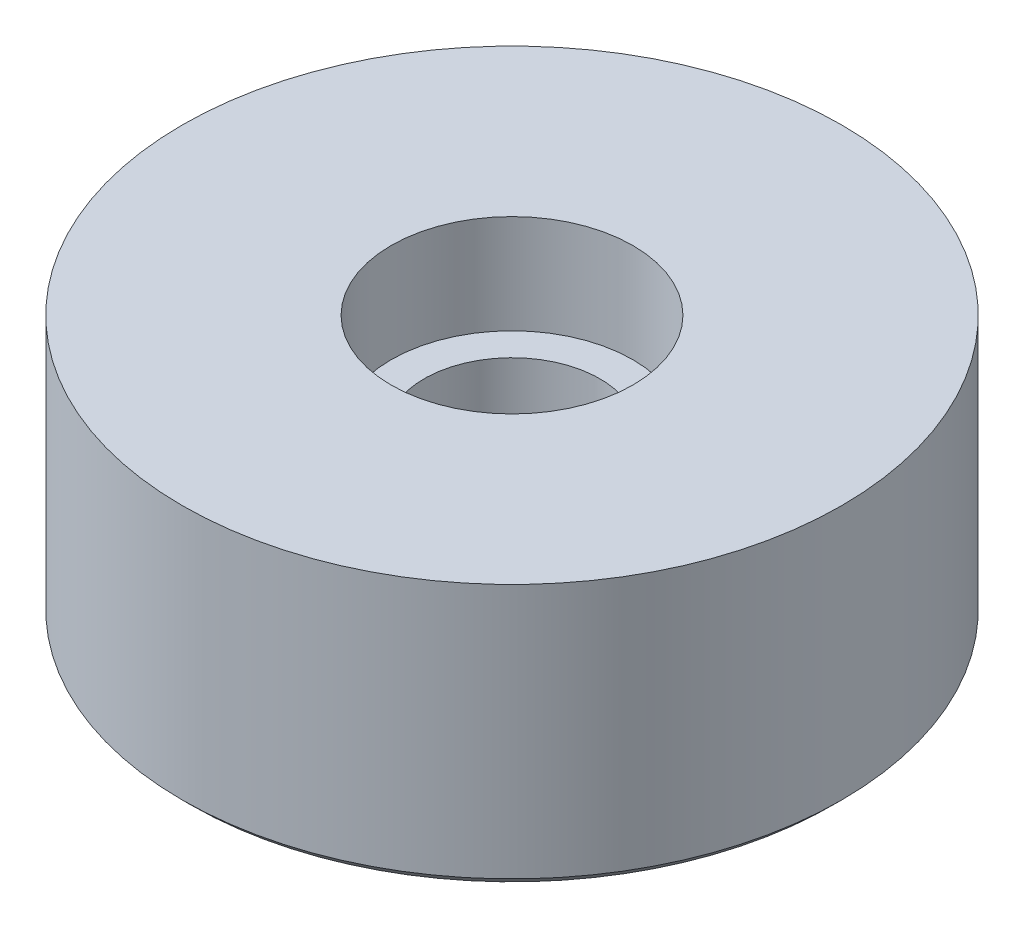
ISO-10303-21;
HEADER;
FILE_DESCRIPTION(('STEP AP214'),'2;1');
FILE_NAME('part.step','',(''),(''),'','','');
FILE_SCHEMA(('AUTOMOTIVE_DESIGN { 1 0 10303 214 1 1 1 1 }'));
ENDSEC;
DATA;
#1=APPLICATION_CONTEXT('core data for automotive mechanical design processes');
#2=APPLICATION_PROTOCOL_DEFINITION('international standard','automotive_design',2000,#1);
#3=PRODUCT_CONTEXT('',#1,'mechanical');
#4=PRODUCT('Part','Part','',(#3));
#5=PRODUCT_RELATED_PRODUCT_CATEGORY('part','',(#4));
#6=PRODUCT_DEFINITION_FORMATION('','',#4);
#7=PRODUCT_DEFINITION_CONTEXT('part definition',#1,'design');
#8=PRODUCT_DEFINITION('design','',#6,#7);
#9=PRODUCT_DEFINITION_SHAPE('','',#8);
#10=(LENGTH_UNIT() NAMED_UNIT(*) SI_UNIT(.MILLI.,.METRE.));
#11=(NAMED_UNIT(*) PLANE_ANGLE_UNIT() SI_UNIT($,.RADIAN.));
#12=(NAMED_UNIT(*) SI_UNIT($,.STERADIAN.) SOLID_ANGLE_UNIT());
#13=UNCERTAINTY_MEASURE_WITH_UNIT(LENGTH_MEASURE(1.E-05),#10,'distance_accuracy_value','');
#14=(GEOMETRIC_REPRESENTATION_CONTEXT(3) GLOBAL_UNCERTAINTY_ASSIGNED_CONTEXT((#13)) GLOBAL_UNIT_ASSIGNED_CONTEXT((#10,
#11,#12)) REPRESENTATION_CONTEXT('',''));
#15=CARTESIAN_POINT('',(0.,0.,0.));
#16=DIRECTION('',(0.,0.,1.));
#17=DIRECTION('',(1.,0.,0.));
#18=AXIS2_PLACEMENT_3D('',#15,#16,#17);
#19=CARTESIAN_POINT('',(0.,12.,0.));
#20=DIRECTION('',(0.,-1.,0.));
#21=DIRECTION('',(0.,0.,-1.));
#22=AXIS2_PLACEMENT_3D('',#19,#20,#21);
#23=CYLINDRICAL_SURFACE('',#22,4.);
#24=CARTESIAN_POINT('',(0.,0.,0.));
#25=DIRECTION('',(0.,1.,0.));
#26=DIRECTION('',(0.,0.,1.));
#27=AXIS2_PLACEMENT_3D('',#24,#25,#26);
#28=CIRCLE('',#27,4.);
#29=CARTESIAN_POINT('',(0.,0.,4.));
#30=VERTEX_POINT('',#29);
#31=EDGE_CURVE('E53',#30,#30,#28,.T.);
#32=ORIENTED_EDGE('',*,*,#31,.F.);
#33=EDGE_LOOP('',(#32));
#34=FACE_BOUND('',#33,.T.);
#35=CARTESIAN_POINT('',(0.,7.5,0.));
#36=DIRECTION('',(0.,1.,0.));
#37=DIRECTION('',(0.,0.,1.));
#38=AXIS2_PLACEMENT_3D('',#35,#36,#37);
#39=CIRCLE('',#38,4.);
#40=CARTESIAN_POINT('',(0.,7.5,4.));
#41=VERTEX_POINT('',#40);
#42=EDGE_CURVE('E59',#41,#41,#39,.T.);
#43=ORIENTED_EDGE('',*,*,#42,.T.);
#44=EDGE_LOOP('',(#43));
#45=FACE_BOUND('',#44,.T.);
#46=ADVANCED_FACE('F37',(#34,#45),#23,.F.);
#47=CARTESIAN_POINT('',(0.,12.,0.));
#48=DIRECTION('',(0.,1.,0.));
#49=DIRECTION('',(0.,0.,1.));
#50=AXIS2_PLACEMENT_3D('',#47,#48,#49);
#51=PLANE('',#50);
#52=CARTESIAN_POINT('',(0.,12.,0.));
#53=DIRECTION('',(0.,1.,0.));
#54=DIRECTION('',(0.,0.,1.));
#55=AXIS2_PLACEMENT_3D('',#52,#53,#54);
#56=CIRCLE('',#55,5.5);
#57=CARTESIAN_POINT('',(0.,12.,5.5));
#58=VERTEX_POINT('',#57);
#59=EDGE_CURVE('E56',#58,#58,#56,.T.);
#60=ORIENTED_EDGE('',*,*,#59,.F.);
#61=EDGE_LOOP('',(#60));
#62=FACE_BOUND('',#61,.T.);
#63=CARTESIAN_POINT('',(0.,12.,0.));
#64=DIRECTION('',(0.,1.,0.));
#65=DIRECTION('',(0.,0.,1.));
#66=AXIS2_PLACEMENT_3D('',#63,#64,#65);
#67=CIRCLE('',#66,15.);
#68=CARTESIAN_POINT('',(0.,12.,15.));
#69=VERTEX_POINT('',#68);
#70=EDGE_CURVE('E49',#69,#69,#67,.T.);
#71=ORIENTED_EDGE('',*,*,#70,.T.);
#72=EDGE_LOOP('',(#71));
#73=FACE_BOUND('',#72,.T.);
#74=ADVANCED_FACE('F84',(#62,#73),#51,.T.);
#75=CARTESIAN_POINT('',(0.,0.,0.));
#76=DIRECTION('',(0.,1.,0.));
#77=DIRECTION('',(0.,0.,1.));
#78=AXIS2_PLACEMENT_3D('',#75,#76,#77);
#79=PLANE('',#78);
#80=CARTESIAN_POINT('',(0.,0.,0.));
#81=DIRECTION('',(0.,1.,0.));
#82=DIRECTION('',(0.,0.,1.));
#83=AXIS2_PLACEMENT_3D('',#80,#81,#82);
#84=CIRCLE('',#83,14.6);
#85=CARTESIAN_POINT('',(0.,0.,14.6));
#86=VERTEX_POINT('',#85);
#87=EDGE_CURVE('E10',#86,#86,#84,.F.);
#88=ORIENTED_EDGE('',*,*,#87,.T.);
#89=EDGE_LOOP('',(#88));
#90=FACE_BOUND('',#89,.T.);
#91=ORIENTED_EDGE('',*,*,#31,.T.);
#92=EDGE_LOOP('',(#91));
#93=FACE_BOUND('',#92,.T.);
#94=ADVANCED_FACE('F81',(#90,#93),#79,.F.);
#95=CARTESIAN_POINT('',(0.,12.,0.));
#96=DIRECTION('',(0.,-1.,0.));
#97=DIRECTION('',(0.,0.,-1.));
#98=AXIS2_PLACEMENT_3D('',#95,#96,#97);
#99=CYLINDRICAL_SURFACE('',#98,15.);
#100=CARTESIAN_POINT('',(0.,0.399999869282052,0.));
#101=DIRECTION('',(0.,1.,0.));
#102=DIRECTION('',(0.,0.,1.));
#103=AXIS2_PLACEMENT_3D('',#100,#101,#102);
#104=CIRCLE('',#103,15.);
#105=CARTESIAN_POINT('',(0.,0.399999869282052,15.));
#106=VERTEX_POINT('',#105);
#107=EDGE_CURVE('E45',#106,#106,#104,.T.);
#108=ORIENTED_EDGE('',*,*,#107,.T.);
#109=EDGE_LOOP('',(#108));
#110=FACE_BOUND('',#109,.T.);
#111=ORIENTED_EDGE('',*,*,#70,.F.);
#112=EDGE_LOOP('',(#111));
#113=FACE_BOUND('',#112,.T.);
#114=ADVANCED_FACE('F72',(#110,#113),#99,.T.);
#115=CARTESIAN_POINT('',(0.,7.5,0.));
#116=DIRECTION('',(0.,1.,0.));
#117=DIRECTION('',(0.,0.,1.));
#118=AXIS2_PLACEMENT_3D('',#115,#116,#117);
#119=CYLINDRICAL_SURFACE('',#118,5.5);
#120=ORIENTED_EDGE('',*,*,#59,.T.);
#121=EDGE_LOOP('',(#120));
#122=FACE_BOUND('',#121,.T.);
#123=CARTESIAN_POINT('',(0.,7.5,0.));
#124=DIRECTION('',(0.,1.,0.));
#125=DIRECTION('',(0.,0.,1.));
#126=AXIS2_PLACEMENT_3D('',#123,#124,#125);
#127=CIRCLE('',#126,5.5);
#128=CARTESIAN_POINT('',(0.,7.5,5.5));
#129=VERTEX_POINT('',#128);
#130=EDGE_CURVE('E61',#129,#129,#127,.T.);
#131=ORIENTED_EDGE('',*,*,#130,.F.);
#132=EDGE_LOOP('',(#131));
#133=FACE_BOUND('',#132,.T.);
#134=ADVANCED_FACE('F70',(#122,#133),#119,.F.);
#135=CARTESIAN_POINT('',(0.,7.5,0.));
#136=DIRECTION('',(0.,1.,0.));
#137=DIRECTION('',(0.,0.,1.));
#138=AXIS2_PLACEMENT_3D('',#135,#136,#137);
#139=PLANE('',#138);
#140=ORIENTED_EDGE('',*,*,#42,.F.);
#141=EDGE_LOOP('',(#140));
#142=FACE_BOUND('',#141,.T.);
#143=ORIENTED_EDGE('',*,*,#130,.T.);
#144=EDGE_LOOP('',(#143));
#145=FACE_BOUND('',#144,.T.);
#146=ADVANCED_FACE('F68',(#142,#145),#139,.T.);
#147=CARTESIAN_POINT('',(0.,0.399999869282052,0.));
#148=DIRECTION('',(0.,1.,0.));
#149=DIRECTION('',(0.,0.,1.));
#150=AXIS2_PLACEMENT_3D('',#147,#148,#149);
#151=CONICAL_SURFACE('',#150,15.,0.785398326794904);
#152=ORIENTED_EDGE('',*,*,#87,.F.);
#153=EDGE_LOOP('',(#152));
#154=FACE_BOUND('',#153,.T.);
#155=ORIENTED_EDGE('',*,*,#107,.F.);
#156=EDGE_LOOP('',(#155));
#157=FACE_BOUND('',#156,.T.);
#158=ADVANCED_FACE('F40',(#154,#157),#151,.T.);
#159=CLOSED_SHELL('',(#46,#74,#94,#114,#134,#146,#158));
#160=MANIFOLD_SOLID_BREP('B2',#159);
#161=ADVANCED_BREP_SHAPE_REPRESENTATION('',(#18,#160),#14);
#162=SHAPE_DEFINITION_REPRESENTATION(#9,#161);
ENDSEC;
END-ISO-10303-21;
